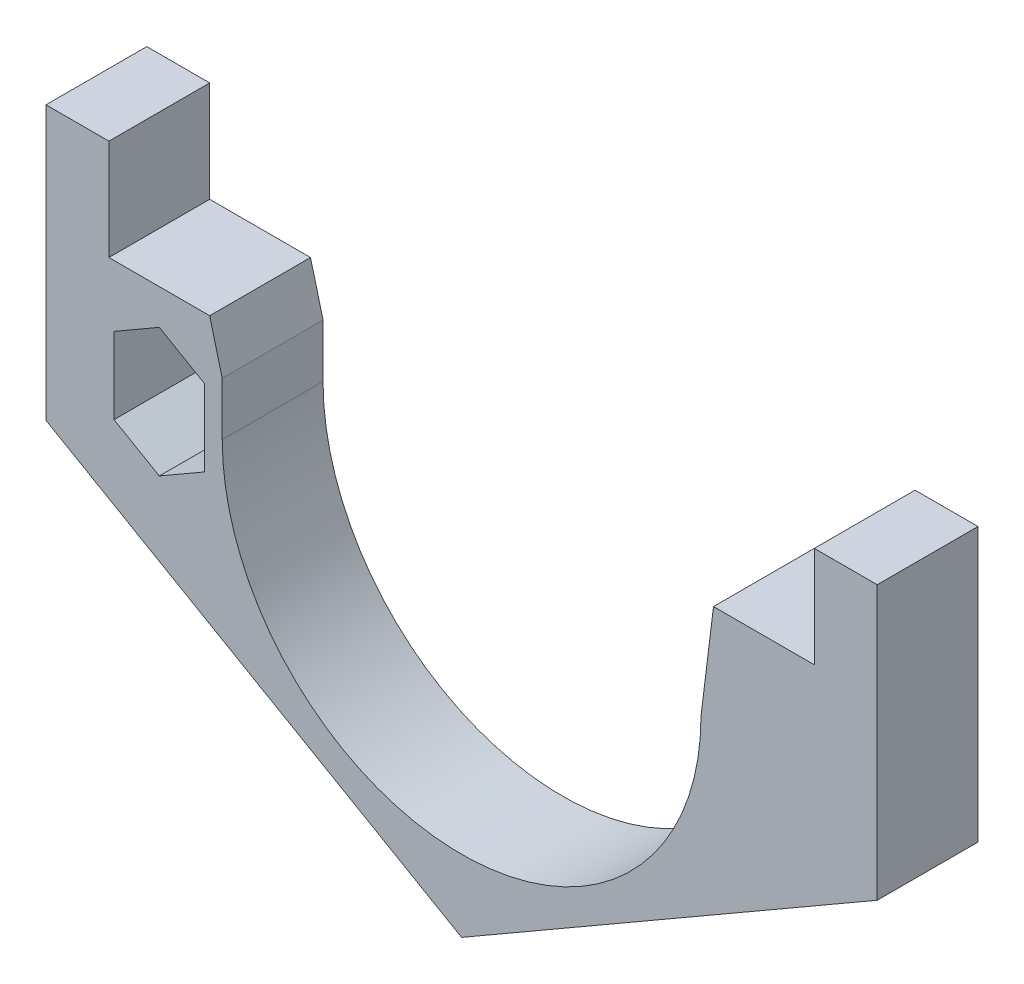
ISO-10303-21;
HEADER;
FILE_DESCRIPTION(('STEP AP214'),'2;1');
FILE_NAME('part.step','',(''),(''),'','','');
FILE_SCHEMA(('AUTOMOTIVE_DESIGN { 1 0 10303 214 1 1 1 1 }'));
ENDSEC;
DATA;
#1=APPLICATION_CONTEXT('core data for automotive mechanical design processes');
#2=APPLICATION_PROTOCOL_DEFINITION('international standard','automotive_design',2000,#1);
#3=PRODUCT_CONTEXT('',#1,'mechanical');
#4=PRODUCT('Part','Part','',(#3));
#5=PRODUCT_RELATED_PRODUCT_CATEGORY('part','',(#4));
#6=PRODUCT_DEFINITION_FORMATION('','',#4);
#7=PRODUCT_DEFINITION_CONTEXT('part definition',#1,'design');
#8=PRODUCT_DEFINITION('design','',#6,#7);
#9=PRODUCT_DEFINITION_SHAPE('','',#8);
#10=(LENGTH_UNIT() NAMED_UNIT(*) SI_UNIT(.MILLI.,.METRE.));
#11=(NAMED_UNIT(*) PLANE_ANGLE_UNIT() SI_UNIT($,.RADIAN.));
#12=(NAMED_UNIT(*) SI_UNIT($,.STERADIAN.) SOLID_ANGLE_UNIT());
#13=UNCERTAINTY_MEASURE_WITH_UNIT(LENGTH_MEASURE(1.E-05),#10,'distance_accuracy_value','');
#14=(GEOMETRIC_REPRESENTATION_CONTEXT(3) GLOBAL_UNCERTAINTY_ASSIGNED_CONTEXT((#13)) GLOBAL_UNIT_ASSIGNED_CONTEXT((#10,
#11,#12)) REPRESENTATION_CONTEXT('',''));
#15=CARTESIAN_POINT('',(0.,0.,0.));
#16=DIRECTION('',(0.,0.,1.));
#17=DIRECTION('',(1.,0.,0.));
#18=AXIS2_PLACEMENT_3D('',#15,#16,#17);
#19=CARTESIAN_POINT('',(0.,0.,20.));
#20=DIRECTION('',(0.,0.,1.));
#21=DIRECTION('',(1.,0.,0.));
#22=AXIS2_PLACEMENT_3D('',#19,#20,#21);
#23=PLANE('',#22);
#24=DIRECTION('',(0.,1.,0.));
#25=VECTOR('',#24,1.);
#26=CARTESIAN_POINT('',(-69.984452807585,20.0689803218662,20.));
#27=LINE('',#26,#25);
#28=CARTESIAN_POINT('',(-69.984452807585,20.0689803218662,20.));
#29=VERTEX_POINT('',#28);
#30=CARTESIAN_POINT('',(-69.9844528075851,40.0689803218662,20.));
#31=VERTEX_POINT('',#30);
#32=EDGE_CURVE('E225',#29,#31,#27,.T.);
#33=ORIENTED_EDGE('',*,*,#32,.T.);
#34=DIRECTION('',(-1.,0.,0.));
#35=VECTOR('',#34,1.);
#36=CARTESIAN_POINT('',(-69.9844528075851,40.0689803218662,20.));
#37=LINE('',#36,#35);
#38=CARTESIAN_POINT('',(-82.468350794959,40.0689803218662,20.));
#39=VERTEX_POINT('',#38);
#40=EDGE_CURVE('E228',#31,#39,#37,.T.);
#41=ORIENTED_EDGE('',*,*,#40,.T.);
#42=DIRECTION('',(0.,-1.,0.));
#43=VECTOR('',#42,1.);
#44=CARTESIAN_POINT('',(-82.468350794959,40.0689803218662,20.));
#45=LINE('',#44,#43);
#46=CARTESIAN_POINT('',(-82.4683507949589,-14.1633542721961,20.));
#47=VERTEX_POINT('',#46);
#48=EDGE_CURVE('E231',#39,#47,#45,.T.);
#49=ORIENTED_EDGE('',*,*,#48,.T.);
#50=DIRECTION('',(0.86602540378444,-0.499999999999998,0.));
#51=VECTOR('',#50,1.);
#52=CARTESIAN_POINT('',(0.,-61.7764788032899,20.));
#53=LINE('',#52,#51);
#54=CARTESIAN_POINT('',(0.,-61.7764788032899,20.));
#55=VERTEX_POINT('',#54);
#56=EDGE_CURVE('E233',#47,#55,#53,.T.);
#57=ORIENTED_EDGE('',*,*,#56,.T.);
#58=DIRECTION('',(0.86602540378444,0.499999999999998,0.));
#59=VECTOR('',#58,1.);
#60=CARTESIAN_POINT('',(0.,-61.7764788032899,20.));
#61=LINE('',#60,#59);
#62=CARTESIAN_POINT('',(82.4683507949589,-14.1633542721961,20.));
#63=VERTEX_POINT('',#62);
#64=EDGE_CURVE('E236',#55,#63,#61,.T.);
#65=ORIENTED_EDGE('',*,*,#64,.T.);
#66=DIRECTION('',(0.,1.,0.));
#67=VECTOR('',#66,1.);
#68=CARTESIAN_POINT('',(82.4683507949589,-14.1633542721961,20.));
#69=LINE('',#68,#67);
#70=CARTESIAN_POINT('',(82.468350794959,40.0689803218662,20.));
#71=VERTEX_POINT('',#70);
#72=EDGE_CURVE('E238',#63,#71,#69,.T.);
#73=ORIENTED_EDGE('',*,*,#72,.T.);
#74=DIRECTION('',(-1.,0.,0.));
#75=VECTOR('',#74,1.);
#76=CARTESIAN_POINT('',(69.9844528075851,40.0689803218662,20.));
#77=LINE('',#76,#75);
#78=CARTESIAN_POINT('',(69.9844528075851,40.0689803218662,20.));
#79=VERTEX_POINT('',#78);
#80=EDGE_CURVE('E241',#71,#79,#77,.T.);
#81=ORIENTED_EDGE('',*,*,#80,.T.);
#82=DIRECTION('',(0.,-1.,0.));
#83=VECTOR('',#82,1.);
#84=CARTESIAN_POINT('',(69.984452807585,20.0689803218662,20.));
#85=LINE('',#84,#83);
#86=CARTESIAN_POINT('',(69.984452807585,20.0689803218662,20.));
#87=VERTEX_POINT('',#86);
#88=EDGE_CURVE('E243',#79,#87,#85,.T.);
#89=ORIENTED_EDGE('',*,*,#88,.T.);
#90=DIRECTION('',(-1.,0.,0.));
#91=VECTOR('',#90,1.);
#92=CARTESIAN_POINT('',(49.984452807585,20.0689803218662,20.));
#93=LINE('',#92,#91);
#94=CARTESIAN_POINT('',(49.984452807585,20.0689803218662,20.));
#95=VERTEX_POINT('',#94);
#96=EDGE_CURVE('E245',#87,#95,#93,.T.);
#97=ORIENTED_EDGE('',*,*,#96,.T.);
#98=DIRECTION('',(-0.122857826012547,-0.992424281538632,0.));
#99=VECTOR('',#98,1.);
#100=CARTESIAN_POINT('',(49.984452807585,20.0689803218662,20.));
#101=LINE('',#100,#99);
#102=CARTESIAN_POINT('',(47.4999999999533,2.04558592287185E-11,20.));
#103=VERTEX_POINT('',#102);
#104=EDGE_CURVE('E247',#95,#103,#101,.T.);
#105=ORIENTED_EDGE('',*,*,#104,.T.);
#106=CARTESIAN_POINT('',(0.,0.,20.));
#107=DIRECTION('',(0.,0.,-1.));
#108=DIRECTION('',(1.,0.,0.));
#109=AXIS2_PLACEMENT_3D('',#106,#107,#108);
#110=CIRCLE('',#109,47.5);
#111=CARTESIAN_POINT('',(-47.5,2.05305101285412E-11,20.));
#112=VERTEX_POINT('',#111);
#113=EDGE_CURVE('E249',#103,#112,#110,.T.);
#114=ORIENTED_EDGE('',*,*,#113,.T.);
#115=DIRECTION('',(0.,1.,0.));
#116=VECTOR('',#115,1.);
#117=CARTESIAN_POINT('',(-47.5000000000467,2.05321870616615E-11,20.));
#118=LINE('',#117,#116);
#119=CARTESIAN_POINT('',(-47.5000000000467,10.5689803218662,20.));
#120=VERTEX_POINT('',#119);
#121=EDGE_CURVE('E251',#112,#120,#118,.T.);
#122=ORIENTED_EDGE('',*,*,#121,.T.);
#123=DIRECTION('',(-0.253012247802464,0.967463075503114,0.));
#124=VECTOR('',#123,1.);
#125=CARTESIAN_POINT('',(-47.5000000000467,10.5689803218662,20.));
#126=LINE('',#125,#124);
#127=CARTESIAN_POINT('',(-49.984452807585,20.0689803218662,20.));
#128=VERTEX_POINT('',#127);
#129=EDGE_CURVE('E253',#120,#128,#126,.T.);
#130=ORIENTED_EDGE('',*,*,#129,.T.);
#131=DIRECTION('',(-1.,0.,0.));
#132=VECTOR('',#131,1.);
#133=CARTESIAN_POINT('',(-49.984452807585,20.0689803218662,20.));
#134=LINE('',#133,#132);
#135=EDGE_CURVE('E255',#128,#29,#134,.T.);
#136=ORIENTED_EDGE('',*,*,#135,.T.);
#137=EDGE_LOOP('',(#33,#41,#49,#57,#65,#73,#81,#89,#97,#105,#114,#122,#130,#136));
#138=FACE_BOUND('',#137,.T.);
#139=DIRECTION('',(0.,-1.,0.));
#140=VECTOR('',#139,1.);
#141=CARTESIAN_POINT('',(-68.9689056151455,7.88180407490607,20.));
#142=LINE('',#141,#140);
#143=CARTESIAN_POINT('',(-68.9689056151455,7.88180407490607,20.));
#144=VERTEX_POINT('',#143);
#145=CARTESIAN_POINT('',(-68.9689056151455,-7.28624336352292,20.));
#146=VERTEX_POINT('',#145);
#147=EDGE_CURVE('E180',#144,#146,#142,.T.);
#148=ORIENTED_EDGE('',*,*,#147,.F.);
#149=DIRECTION('',(-0.86602540378444,-0.499999999999998,0.));
#150=VECTOR('',#149,1.);
#151=CARTESIAN_POINT('',(-59.9844528075961,13.0689803218662,20.));
#152=LINE('',#151,#150);
#153=CARTESIAN_POINT('',(-59.9844528075961,13.0689803218662,20.));
#154=VERTEX_POINT('',#153);
#155=EDGE_CURVE('E172',#154,#144,#152,.T.);
#156=ORIENTED_EDGE('',*,*,#155,.F.);
#157=DIRECTION('',(-0.86602540378444,0.499999999999998,0.));
#158=VECTOR('',#157,1.);
#159=CARTESIAN_POINT('',(-59.9844528075961,13.0689803218662,20.));
#160=LINE('',#159,#158);
#161=CARTESIAN_POINT('',(-51.0000000000467,7.88180407490607,20.));
#162=VERTEX_POINT('',#161);
#163=EDGE_CURVE('E201',#162,#154,#160,.T.);
#164=ORIENTED_EDGE('',*,*,#163,.F.);
#165=DIRECTION('',(0.,1.,0.));
#166=VECTOR('',#165,1.);
#167=CARTESIAN_POINT('',(-51.0000000000467,7.88180407490607,20.));
#168=LINE('',#167,#166);
#169=CARTESIAN_POINT('',(-51.0000000000467,-7.28624336352292,20.));
#170=VERTEX_POINT('',#169);
#171=EDGE_CURVE('E199',#170,#162,#168,.T.);
#172=ORIENTED_EDGE('',*,*,#171,.F.);
#173=DIRECTION('',(0.86602540378444,0.499999999999998,0.));
#174=VECTOR('',#173,1.);
#175=CARTESIAN_POINT('',(-59.9844528075961,-12.473419610483,20.));
#176=LINE('',#175,#174);
#177=CARTESIAN_POINT('',(-59.9844528075961,-12.473419610483,20.));
#178=VERTEX_POINT('',#177);
#179=EDGE_CURVE('E195',#178,#170,#176,.T.);
#180=ORIENTED_EDGE('',*,*,#179,.F.);
#181=DIRECTION('',(0.86602540378444,-0.499999999999998,0.));
#182=VECTOR('',#181,1.);
#183=CARTESIAN_POINT('',(-59.9844528075961,-12.473419610483,20.));
#184=LINE('',#183,#182);
#185=EDGE_CURVE('E193',#146,#178,#184,.T.);
#186=ORIENTED_EDGE('',*,*,#185,.F.);
#187=EDGE_LOOP('',(#148,#156,#164,#172,#180,#186));
#188=FACE_BOUND('',#187,.T.);
#189=ADVANCED_FACE('F35',(#138,#188),#23,.T.);
#190=CARTESIAN_POINT('',(0.,0.,0.));
#191=DIRECTION('',(0.,0.,1.));
#192=DIRECTION('',(1.,0.,0.));
#193=AXIS2_PLACEMENT_3D('',#190,#191,#192);
#194=PLANE('',#193);
#195=DIRECTION('',(0.,1.,0.));
#196=VECTOR('',#195,1.);
#197=CARTESIAN_POINT('',(-69.984452807585,20.0689803218662,0.));
#198=LINE('',#197,#196);
#199=CARTESIAN_POINT('',(-69.984452807585,20.0689803218662,0.));
#200=VERTEX_POINT('',#199);
#201=CARTESIAN_POINT('',(-69.9844528075851,40.0689803218662,0.));
#202=VERTEX_POINT('',#201);
#203=EDGE_CURVE('E188',#200,#202,#198,.T.);
#204=ORIENTED_EDGE('',*,*,#203,.F.);
#205=DIRECTION('',(-1.,0.,0.));
#206=VECTOR('',#205,1.);
#207=CARTESIAN_POINT('',(-49.984452807585,20.0689803218662,0.));
#208=LINE('',#207,#206);
#209=CARTESIAN_POINT('',(-49.984452807585,20.0689803218662,0.));
#210=VERTEX_POINT('',#209);
#211=EDGE_CURVE('E229',#210,#200,#208,.T.);
#212=ORIENTED_EDGE('',*,*,#211,.F.);
#213=DIRECTION('',(-0.253012247802464,0.967463075503114,0.));
#214=VECTOR('',#213,1.);
#215=CARTESIAN_POINT('',(-47.5000000000467,10.5689803218662,0.));
#216=LINE('',#215,#214);
#217=CARTESIAN_POINT('',(-47.5000000000467,10.5689803218662,0.));
#218=VERTEX_POINT('',#217);
#219=EDGE_CURVE('E286',#218,#210,#216,.T.);
#220=ORIENTED_EDGE('',*,*,#219,.F.);
#221=DIRECTION('',(0.,1.,0.));
#222=VECTOR('',#221,1.);
#223=CARTESIAN_POINT('',(-47.5000000000467,2.05321870616615E-11,0.));
#224=LINE('',#223,#222);
#225=CARTESIAN_POINT('',(-47.5,2.05305101285412E-11,0.));
#226=VERTEX_POINT('',#225);
#227=EDGE_CURVE('E284',#226,#218,#224,.T.);
#228=ORIENTED_EDGE('',*,*,#227,.F.);
#229=CARTESIAN_POINT('',(0.,0.,0.));
#230=DIRECTION('',(0.,0.,-1.));
#231=DIRECTION('',(1.,0.,0.));
#232=AXIS2_PLACEMENT_3D('',#229,#230,#231);
#233=CIRCLE('',#232,47.5);
#234=CARTESIAN_POINT('',(47.4999999999533,2.04558592287185E-11,0.));
#235=VERTEX_POINT('',#234);
#236=EDGE_CURVE('E282',#235,#226,#233,.T.);
#237=ORIENTED_EDGE('',*,*,#236,.F.);
#238=DIRECTION('',(-0.122857826012547,-0.992424281538632,0.));
#239=VECTOR('',#238,1.);
#240=CARTESIAN_POINT('',(49.984452807585,20.0689803218662,0.));
#241=LINE('',#240,#239);
#242=CARTESIAN_POINT('',(49.984452807585,20.0689803218662,0.));
#243=VERTEX_POINT('',#242);
#244=EDGE_CURVE('E280',#243,#235,#241,.T.);
#245=ORIENTED_EDGE('',*,*,#244,.F.);
#246=DIRECTION('',(-1.,0.,0.));
#247=VECTOR('',#246,1.);
#248=CARTESIAN_POINT('',(49.984452807585,20.0689803218662,0.));
#249=LINE('',#248,#247);
#250=CARTESIAN_POINT('',(69.984452807585,20.0689803218662,0.));
#251=VERTEX_POINT('',#250);
#252=EDGE_CURVE('E278',#251,#243,#249,.T.);
#253=ORIENTED_EDGE('',*,*,#252,.F.);
#254=DIRECTION('',(0.,-1.,0.));
#255=VECTOR('',#254,1.);
#256=CARTESIAN_POINT('',(69.984452807585,20.0689803218662,0.));
#257=LINE('',#256,#255);
#258=CARTESIAN_POINT('',(69.9844528075851,40.0689803218662,0.));
#259=VERTEX_POINT('',#258);
#260=EDGE_CURVE('E276',#259,#251,#257,.T.);
#261=ORIENTED_EDGE('',*,*,#260,.F.);
#262=DIRECTION('',(-1.,0.,0.));
#263=VECTOR('',#262,1.);
#264=CARTESIAN_POINT('',(69.9844528075851,40.0689803218662,0.));
#265=LINE('',#264,#263);
#266=CARTESIAN_POINT('',(82.468350794959,40.0689803218662,0.));
#267=VERTEX_POINT('',#266);
#268=EDGE_CURVE('E274',#267,#259,#265,.T.);
#269=ORIENTED_EDGE('',*,*,#268,.F.);
#270=DIRECTION('',(0.,1.,0.));
#271=VECTOR('',#270,1.);
#272=CARTESIAN_POINT('',(82.468350794959,40.0689803218662,0.));
#273=LINE('',#272,#271);
#274=CARTESIAN_POINT('',(82.4683507949589,-14.1633542721961,0.));
#275=VERTEX_POINT('',#274);
#276=EDGE_CURVE('E271',#275,#267,#273,.T.);
#277=ORIENTED_EDGE('',*,*,#276,.F.);
#278=DIRECTION('',(0.86602540378444,0.499999999999998,0.));
#279=VECTOR('',#278,1.);
#280=CARTESIAN_POINT('',(0.,-61.7764788032899,0.));
#281=LINE('',#280,#279);
#282=CARTESIAN_POINT('',(0.,-61.7764788032899,0.));
#283=VERTEX_POINT('',#282);
#284=EDGE_CURVE('E268',#283,#275,#281,.T.);
#285=ORIENTED_EDGE('',*,*,#284,.F.);
#286=DIRECTION('',(0.86602540378444,-0.499999999999998,0.));
#287=VECTOR('',#286,1.);
#288=CARTESIAN_POINT('',(0.,-61.7764788032899,0.));
#289=LINE('',#288,#287);
#290=CARTESIAN_POINT('',(-82.4683507949589,-14.1633542721961,0.));
#291=VERTEX_POINT('',#290);
#292=EDGE_CURVE('E265',#291,#283,#289,.T.);
#293=ORIENTED_EDGE('',*,*,#292,.F.);
#294=DIRECTION('',(0.,-1.,0.));
#295=VECTOR('',#294,1.);
#296=CARTESIAN_POINT('',(-82.4683507949589,-14.1633542721961,0.));
#297=LINE('',#296,#295);
#298=CARTESIAN_POINT('',(-82.468350794959,40.0689803218662,0.));
#299=VERTEX_POINT('',#298);
#300=EDGE_CURVE('E263',#299,#291,#297,.T.);
#301=ORIENTED_EDGE('',*,*,#300,.F.);
#302=DIRECTION('',(-1.,0.,0.));
#303=VECTOR('',#302,1.);
#304=CARTESIAN_POINT('',(-69.9844528075851,40.0689803218662,0.));
#305=LINE('',#304,#303);
#306=EDGE_CURVE('E260',#202,#299,#305,.T.);
#307=ORIENTED_EDGE('',*,*,#306,.F.);
#308=EDGE_LOOP('',(#204,#212,#220,#228,#237,#245,#253,#261,#269,#277,#285,#293,#301,#307));
#309=FACE_BOUND('',#308,.T.);
#310=DIRECTION('',(-0.86602540378444,-0.499999999999998,0.));
#311=VECTOR('',#310,1.);
#312=CARTESIAN_POINT('',(-59.9844528075961,13.0689803218662,0.));
#313=LINE('',#312,#311);
#314=CARTESIAN_POINT('',(-59.9844528075961,13.0689803218662,0.));
#315=VERTEX_POINT('',#314);
#316=CARTESIAN_POINT('',(-68.9689056151455,7.88180407490607,0.));
#317=VERTEX_POINT('',#316);
#318=EDGE_CURVE('E58',#315,#317,#313,.T.);
#319=ORIENTED_EDGE('',*,*,#318,.T.);
#320=DIRECTION('',(0.,-1.,0.));
#321=VECTOR('',#320,1.);
#322=CARTESIAN_POINT('',(-68.9689056151455,7.88180407490607,0.));
#323=LINE('',#322,#321);
#324=CARTESIAN_POINT('',(-68.9689056151455,-7.28624336352292,0.));
#325=VERTEX_POINT('',#324);
#326=EDGE_CURVE('E187',#317,#325,#323,.T.);
#327=ORIENTED_EDGE('',*,*,#326,.T.);
#328=DIRECTION('',(0.86602540378444,-0.499999999999998,0.));
#329=VECTOR('',#328,1.);
#330=CARTESIAN_POINT('',(-59.9844528075961,-12.473419610483,0.));
#331=LINE('',#330,#329);
#332=CARTESIAN_POINT('',(-59.9844528075961,-12.473419610483,0.));
#333=VERTEX_POINT('',#332);
#334=EDGE_CURVE('E205',#325,#333,#331,.T.);
#335=ORIENTED_EDGE('',*,*,#334,.T.);
#336=DIRECTION('',(0.86602540378444,0.499999999999998,0.));
#337=VECTOR('',#336,1.);
#338=CARTESIAN_POINT('',(-59.9844528075961,-12.473419610483,0.));
#339=LINE('',#338,#337);
#340=CARTESIAN_POINT('',(-51.0000000000467,-7.28624336352292,0.));
#341=VERTEX_POINT('',#340);
#342=EDGE_CURVE('E208',#333,#341,#339,.T.);
#343=ORIENTED_EDGE('',*,*,#342,.T.);
#344=DIRECTION('',(0.,1.,0.));
#345=VECTOR('',#344,1.);
#346=CARTESIAN_POINT('',(-51.0000000000467,7.88180407490607,0.));
#347=LINE('',#346,#345);
#348=CARTESIAN_POINT('',(-51.0000000000467,7.88180407490607,0.));
#349=VERTEX_POINT('',#348);
#350=EDGE_CURVE('E211',#341,#349,#347,.T.);
#351=ORIENTED_EDGE('',*,*,#350,.T.);
#352=DIRECTION('',(-0.86602540378444,0.499999999999998,0.));
#353=VECTOR('',#352,1.);
#354=CARTESIAN_POINT('',(-59.9844528075961,13.0689803218662,0.));
#355=LINE('',#354,#353);
#356=EDGE_CURVE('E181',#349,#315,#355,.T.);
#357=ORIENTED_EDGE('',*,*,#356,.T.);
#358=EDGE_LOOP('',(#319,#327,#335,#343,#351,#357));
#359=FACE_BOUND('',#358,.T.);
#360=ADVANCED_FACE('F334',(#309,#359),#194,.F.);
#361=CARTESIAN_POINT('',(-69.984452807585,20.0689803218662,20.));
#362=DIRECTION('',(-1.,0.,0.));
#363=DIRECTION('',(0.,-1.,0.));
#364=AXIS2_PLACEMENT_3D('',#361,#362,#363);
#365=PLANE('',#364);
#366=ORIENTED_EDGE('',*,*,#203,.T.);
#367=DIRECTION('',(0.,0.,-1.));
#368=VECTOR('',#367,1.);
#369=CARTESIAN_POINT('',(-69.9844528075851,40.0689803218662,20.));
#370=LINE('',#369,#368);
#371=EDGE_CURVE('E11',#31,#202,#370,.T.);
#372=ORIENTED_EDGE('',*,*,#371,.F.);
#373=ORIENTED_EDGE('',*,*,#32,.F.);
#374=DIRECTION('',(0.,0.,-1.));
#375=VECTOR('',#374,1.);
#376=CARTESIAN_POINT('',(-69.984452807585,20.0689803218662,20.));
#377=LINE('',#376,#375);
#378=EDGE_CURVE('E257',#29,#200,#377,.T.);
#379=ORIENTED_EDGE('',*,*,#378,.T.);
#380=EDGE_LOOP('',(#366,#372,#373,#379));
#381=FACE_BOUND('',#380,.T.);
#382=ADVANCED_FACE('F37',(#381),#365,.F.);
#383=CARTESIAN_POINT('',(-69.9844528075851,40.0689803218662,20.));
#384=DIRECTION('',(0.,-1.,0.));
#385=DIRECTION('',(0.,0.,-1.));
#386=AXIS2_PLACEMENT_3D('',#383,#384,#385);
#387=PLANE('',#386);
#388=ORIENTED_EDGE('',*,*,#306,.T.);
#389=DIRECTION('',(0.,0.,-1.));
#390=VECTOR('',#389,1.);
#391=CARTESIAN_POINT('',(-82.468350794959,40.0689803218662,20.));
#392=LINE('',#391,#390);
#393=EDGE_CURVE('E43',#39,#299,#392,.T.);
#394=ORIENTED_EDGE('',*,*,#393,.F.);
#395=ORIENTED_EDGE('',*,*,#40,.F.);
#396=ORIENTED_EDGE('',*,*,#371,.T.);
#397=EDGE_LOOP('',(#388,#394,#395,#396));
#398=FACE_BOUND('',#397,.T.);
#399=ADVANCED_FACE('F330',(#398),#387,.F.);
#400=CARTESIAN_POINT('',(-82.4683507949589,-14.1633542721961,20.));
#401=DIRECTION('',(1.,0.,0.));
#402=DIRECTION('',(0.,1.,0.));
#403=AXIS2_PLACEMENT_3D('',#400,#401,#402);
#404=PLANE('',#403);
#405=ORIENTED_EDGE('',*,*,#300,.T.);
#406=DIRECTION('',(0.,0.,-1.));
#407=VECTOR('',#406,1.);
#408=CARTESIAN_POINT('',(-82.4683507949589,-14.1633542721961,20.));
#409=LINE('',#408,#407);
#410=EDGE_CURVE('E321',#47,#291,#409,.T.);
#411=ORIENTED_EDGE('',*,*,#410,.F.);
#412=ORIENTED_EDGE('',*,*,#48,.F.);
#413=ORIENTED_EDGE('',*,*,#393,.T.);
#414=EDGE_LOOP('',(#405,#411,#412,#413));
#415=FACE_BOUND('',#414,.T.);
#416=ADVANCED_FACE('F327',(#415),#404,.F.);
#417=CARTESIAN_POINT('',(0.,-61.7764788032899,20.));
#418=DIRECTION('',(0.499999999999998,0.86602540378444,0.));
#419=DIRECTION('',(-0.86602540378444,0.499999999999998,0.));
#420=AXIS2_PLACEMENT_3D('',#417,#418,#419);
#421=PLANE('',#420);
#422=ORIENTED_EDGE('',*,*,#292,.T.);
#423=DIRECTION('',(0.,0.,-1.));
#424=VECTOR('',#423,1.);
#425=CARTESIAN_POINT('',(0.,-61.7764788032899,20.));
#426=LINE('',#425,#424);
#427=EDGE_CURVE('E318',#55,#283,#426,.T.);
#428=ORIENTED_EDGE('',*,*,#427,.F.);
#429=ORIENTED_EDGE('',*,*,#56,.F.);
#430=ORIENTED_EDGE('',*,*,#410,.T.);
#431=EDGE_LOOP('',(#422,#428,#429,#430));
#432=FACE_BOUND('',#431,.T.);
#433=ADVANCED_FACE('F341',(#432),#421,.F.);
#434=CARTESIAN_POINT('',(0.,-61.7764788032899,20.));
#435=DIRECTION('',(-0.499999999999998,0.86602540378444,0.));
#436=DIRECTION('',(-0.86602540378444,-0.499999999999998,0.));
#437=AXIS2_PLACEMENT_3D('',#434,#435,#436);
#438=PLANE('',#437);
#439=ORIENTED_EDGE('',*,*,#284,.T.);
#440=DIRECTION('',(0.,0.,-1.));
#441=VECTOR('',#440,1.);
#442=CARTESIAN_POINT('',(82.4683507949589,-14.1633542721961,20.));
#443=LINE('',#442,#441);
#444=EDGE_CURVE('E315',#63,#275,#443,.T.);
#445=ORIENTED_EDGE('',*,*,#444,.F.);
#446=ORIENTED_EDGE('',*,*,#64,.F.);
#447=ORIENTED_EDGE('',*,*,#427,.T.);
#448=EDGE_LOOP('',(#439,#445,#446,#447));
#449=FACE_BOUND('',#448,.T.);
#450=ADVANCED_FACE('F345',(#449),#438,.F.);
#451=CARTESIAN_POINT('',(82.468350794959,40.0689803218662,20.));
#452=DIRECTION('',(-1.,0.,0.));
#453=DIRECTION('',(0.,-1.,0.));
#454=AXIS2_PLACEMENT_3D('',#451,#452,#453);
#455=PLANE('',#454);
#456=ORIENTED_EDGE('',*,*,#276,.T.);
#457=DIRECTION('',(0.,0.,-1.));
#458=VECTOR('',#457,1.);
#459=CARTESIAN_POINT('',(82.468350794959,40.0689803218662,20.));
#460=LINE('',#459,#458);
#461=EDGE_CURVE('E312',#71,#267,#460,.T.);
#462=ORIENTED_EDGE('',*,*,#461,.F.);
#463=ORIENTED_EDGE('',*,*,#72,.F.);
#464=ORIENTED_EDGE('',*,*,#444,.T.);
#465=EDGE_LOOP('',(#456,#462,#463,#464));
#466=FACE_BOUND('',#465,.T.);
#467=ADVANCED_FACE('F392',(#466),#455,.F.);
#468=CARTESIAN_POINT('',(69.9844528075851,40.0689803218662,20.));
#469=DIRECTION('',(0.,-1.,0.));
#470=DIRECTION('',(1.,0.,0.));
#471=AXIS2_PLACEMENT_3D('',#468,#469,#470);
#472=PLANE('',#471);
#473=ORIENTED_EDGE('',*,*,#268,.T.);
#474=DIRECTION('',(0.,0.,-1.));
#475=VECTOR('',#474,1.);
#476=CARTESIAN_POINT('',(69.9844528075851,40.0689803218662,20.));
#477=LINE('',#476,#475);
#478=EDGE_CURVE('E309',#79,#259,#477,.T.);
#479=ORIENTED_EDGE('',*,*,#478,.F.);
#480=ORIENTED_EDGE('',*,*,#80,.F.);
#481=ORIENTED_EDGE('',*,*,#461,.T.);
#482=EDGE_LOOP('',(#473,#479,#480,#481));
#483=FACE_BOUND('',#482,.T.);
#484=ADVANCED_FACE('F389',(#483),#472,.F.);
#485=CARTESIAN_POINT('',(69.984452807585,20.0689803218662,20.));
#486=DIRECTION('',(1.,0.,0.));
#487=DIRECTION('',(0.,1.,0.));
#488=AXIS2_PLACEMENT_3D('',#485,#486,#487);
#489=PLANE('',#488);
#490=ORIENTED_EDGE('',*,*,#260,.T.);
#491=DIRECTION('',(0.,0.,-1.));
#492=VECTOR('',#491,1.);
#493=CARTESIAN_POINT('',(69.984452807585,20.0689803218662,20.));
#494=LINE('',#493,#492);
#495=EDGE_CURVE('E306',#87,#251,#494,.T.);
#496=ORIENTED_EDGE('',*,*,#495,.F.);
#497=ORIENTED_EDGE('',*,*,#88,.F.);
#498=ORIENTED_EDGE('',*,*,#478,.T.);
#499=EDGE_LOOP('',(#490,#496,#497,#498));
#500=FACE_BOUND('',#499,.T.);
#501=ADVANCED_FACE('F385',(#500),#489,.F.);
#502=CARTESIAN_POINT('',(49.984452807585,20.0689803218662,20.));
#503=DIRECTION('',(0.,-1.,0.));
#504=DIRECTION('',(1.,0.,0.));
#505=AXIS2_PLACEMENT_3D('',#502,#503,#504);
#506=PLANE('',#505);
#507=ORIENTED_EDGE('',*,*,#252,.T.);
#508=DIRECTION('',(0.,0.,-1.));
#509=VECTOR('',#508,1.);
#510=CARTESIAN_POINT('',(49.984452807585,20.0689803218662,20.));
#511=LINE('',#510,#509);
#512=EDGE_CURVE('E303',#95,#243,#511,.T.);
#513=ORIENTED_EDGE('',*,*,#512,.F.);
#514=ORIENTED_EDGE('',*,*,#96,.F.);
#515=ORIENTED_EDGE('',*,*,#495,.T.);
#516=EDGE_LOOP('',(#507,#513,#514,#515));
#517=FACE_BOUND('',#516,.T.);
#518=ADVANCED_FACE('F381',(#517),#506,.F.);
#519=CARTESIAN_POINT('',(49.984452807585,20.0689803218662,20.));
#520=DIRECTION('',(0.992424281538632,-0.122857826012547,0.));
#521=DIRECTION('',(0.122857826012547,0.992424281538633,0.));
#522=AXIS2_PLACEMENT_3D('',#519,#520,#521);
#523=PLANE('',#522);
#524=ORIENTED_EDGE('',*,*,#244,.T.);
#525=DIRECTION('',(0.,0.,-1.));
#526=VECTOR('',#525,1.);
#527=CARTESIAN_POINT('',(47.4999999999533,2.04558592287185E-11,20.));
#528=LINE('',#527,#526);
#529=EDGE_CURVE('E300',#103,#235,#528,.T.);
#530=ORIENTED_EDGE('',*,*,#529,.F.);
#531=ORIENTED_EDGE('',*,*,#104,.F.);
#532=ORIENTED_EDGE('',*,*,#512,.T.);
#533=EDGE_LOOP('',(#524,#530,#531,#532));
#534=FACE_BOUND('',#533,.T.);
#535=ADVANCED_FACE('F376',(#534),#523,.F.);
#536=CARTESIAN_POINT('',(0.,0.,20.));
#537=DIRECTION('',(0.,0.,-1.));
#538=DIRECTION('',(-1.,0.,0.));
#539=AXIS2_PLACEMENT_3D('',#536,#537,#538);
#540=CYLINDRICAL_SURFACE('',#539,47.5);
#541=ORIENTED_EDGE('',*,*,#236,.T.);
#542=DIRECTION('',(0.,0.,-1.));
#543=VECTOR('',#542,1.);
#544=CARTESIAN_POINT('',(-47.5,2.05305101285412E-11,20.));
#545=LINE('',#544,#543);
#546=EDGE_CURVE('E297',#112,#226,#545,.T.);
#547=ORIENTED_EDGE('',*,*,#546,.F.);
#548=ORIENTED_EDGE('',*,*,#113,.F.);
#549=ORIENTED_EDGE('',*,*,#529,.T.);
#550=EDGE_LOOP('',(#541,#547,#548,#549));
#551=FACE_BOUND('',#550,.T.);
#552=ADVANCED_FACE('F370',(#551),#540,.F.);
#553=CARTESIAN_POINT('',(-47.5000000000467,2.05321870616615E-11,20.));
#554=DIRECTION('',(-1.,0.,0.));
#555=DIRECTION('',(0.,0.,1.));
#556=AXIS2_PLACEMENT_3D('',#553,#554,#555);
#557=PLANE('',#556);
#558=ORIENTED_EDGE('',*,*,#227,.T.);
#559=DIRECTION('',(0.,0.,-1.));
#560=VECTOR('',#559,1.);
#561=CARTESIAN_POINT('',(-47.5000000000467,10.5689803218662,20.));
#562=LINE('',#561,#560);
#563=EDGE_CURVE('E294',#120,#218,#562,.T.);
#564=ORIENTED_EDGE('',*,*,#563,.F.);
#565=ORIENTED_EDGE('',*,*,#121,.F.);
#566=ORIENTED_EDGE('',*,*,#546,.T.);
#567=EDGE_LOOP('',(#558,#564,#565,#566));
#568=FACE_BOUND('',#567,.T.);
#569=ADVANCED_FACE('F366',(#568),#557,.F.);
#570=CARTESIAN_POINT('',(-47.5000000000467,10.5689803218662,20.));
#571=DIRECTION('',(-0.967463075503114,-0.253012247802464,0.));
#572=DIRECTION('',(0.253012247802464,-0.967463075503114,0.));
#573=AXIS2_PLACEMENT_3D('',#570,#571,#572);
#574=PLANE('',#573);
#575=ORIENTED_EDGE('',*,*,#219,.T.);
#576=DIRECTION('',(0.,0.,-1.));
#577=VECTOR('',#576,1.);
#578=CARTESIAN_POINT('',(-49.984452807585,20.0689803218662,20.));
#579=LINE('',#578,#577);
#580=EDGE_CURVE('E291',#128,#210,#579,.T.);
#581=ORIENTED_EDGE('',*,*,#580,.F.);
#582=ORIENTED_EDGE('',*,*,#129,.F.);
#583=ORIENTED_EDGE('',*,*,#563,.T.);
#584=EDGE_LOOP('',(#575,#581,#582,#583));
#585=FACE_BOUND('',#584,.T.);
#586=ADVANCED_FACE('F361',(#585),#574,.F.);
#587=CARTESIAN_POINT('',(-49.984452807585,20.0689803218662,20.));
#588=DIRECTION('',(0.,-1.,0.));
#589=DIRECTION('',(1.,0.,0.));
#590=AXIS2_PLACEMENT_3D('',#587,#588,#589);
#591=PLANE('',#590);
#592=ORIENTED_EDGE('',*,*,#211,.T.);
#593=ORIENTED_EDGE('',*,*,#378,.F.);
#594=ORIENTED_EDGE('',*,*,#135,.F.);
#595=ORIENTED_EDGE('',*,*,#580,.T.);
#596=EDGE_LOOP('',(#592,#593,#594,#595));
#597=FACE_BOUND('',#596,.T.);
#598=ADVANCED_FACE('F355',(#597),#591,.F.);
#599=CARTESIAN_POINT('',(-59.9844528075961,13.0689803218662,20.));
#600=DIRECTION('',(0.499999999999998,-0.86602540378444,0.));
#601=DIRECTION('',(0.86602540378444,0.499999999999998,0.));
#602=AXIS2_PLACEMENT_3D('',#599,#600,#601);
#603=PLANE('',#602);
#604=ORIENTED_EDGE('',*,*,#318,.F.);
#605=DIRECTION('',(0.,0.,-1.));
#606=VECTOR('',#605,1.);
#607=CARTESIAN_POINT('',(-59.9844528075961,13.0689803218662,20.));
#608=LINE('',#607,#606);
#609=EDGE_CURVE('E176',#154,#315,#608,.T.);
#610=ORIENTED_EDGE('',*,*,#609,.F.);
#611=ORIENTED_EDGE('',*,*,#155,.T.);
#612=DIRECTION('',(0.,0.,-1.));
#613=VECTOR('',#612,1.);
#614=CARTESIAN_POINT('',(-68.9689056151455,7.88180407490607,20.));
#615=LINE('',#614,#613);
#616=EDGE_CURVE('E175',#144,#317,#615,.T.);
#617=ORIENTED_EDGE('',*,*,#616,.T.);
#618=EDGE_LOOP('',(#604,#610,#611,#617));
#619=FACE_BOUND('',#618,.T.);
#620=ADVANCED_FACE('F174',(#619),#603,.T.);
#621=CARTESIAN_POINT('',(-68.9689056151455,7.88180407490607,20.));
#622=DIRECTION('',(1.,0.,0.));
#623=DIRECTION('',(0.,0.,-1.));
#624=AXIS2_PLACEMENT_3D('',#621,#622,#623);
#625=PLANE('',#624);
#626=ORIENTED_EDGE('',*,*,#326,.F.);
#627=ORIENTED_EDGE('',*,*,#616,.F.);
#628=ORIENTED_EDGE('',*,*,#147,.T.);
#629=DIRECTION('',(0.,0.,-1.));
#630=VECTOR('',#629,1.);
#631=CARTESIAN_POINT('',(-68.9689056151455,-7.28624336352292,20.));
#632=LINE('',#631,#630);
#633=EDGE_CURVE('E189',#146,#325,#632,.T.);
#634=ORIENTED_EDGE('',*,*,#633,.T.);
#635=EDGE_LOOP('',(#626,#627,#628,#634));
#636=FACE_BOUND('',#635,.T.);
#637=ADVANCED_FACE('F184',(#636),#625,.T.);
#638=CARTESIAN_POINT('',(-59.9844528075961,-12.473419610483,20.));
#639=DIRECTION('',(0.499999999999998,0.86602540378444,0.));
#640=DIRECTION('',(-0.86602540378444,0.499999999999998,0.));
#641=AXIS2_PLACEMENT_3D('',#638,#639,#640);
#642=PLANE('',#641);
#643=ORIENTED_EDGE('',*,*,#334,.F.);
#644=ORIENTED_EDGE('',*,*,#633,.F.);
#645=ORIENTED_EDGE('',*,*,#185,.T.);
#646=DIRECTION('',(0.,0.,-1.));
#647=VECTOR('',#646,1.);
#648=CARTESIAN_POINT('',(-59.9844528075961,-12.473419610483,20.));
#649=LINE('',#648,#647);
#650=EDGE_CURVE('E222',#178,#333,#649,.T.);
#651=ORIENTED_EDGE('',*,*,#650,.T.);
#652=EDGE_LOOP('',(#643,#644,#645,#651));
#653=FACE_BOUND('',#652,.T.);
#654=ADVANCED_FACE('F462',(#653),#642,.T.);
#655=CARTESIAN_POINT('',(-59.9844528075961,-12.473419610483,20.));
#656=DIRECTION('',(-0.499999999999998,0.86602540378444,0.));
#657=DIRECTION('',(-0.86602540378444,-0.499999999999998,0.));
#658=AXIS2_PLACEMENT_3D('',#655,#656,#657);
#659=PLANE('',#658);
#660=ORIENTED_EDGE('',*,*,#342,.F.);
#661=ORIENTED_EDGE('',*,*,#650,.F.);
#662=ORIENTED_EDGE('',*,*,#179,.T.);
#663=DIRECTION('',(0.,0.,-1.));
#664=VECTOR('',#663,1.);
#665=CARTESIAN_POINT('',(-51.0000000000467,-7.28624336352292,20.));
#666=LINE('',#665,#664);
#667=EDGE_CURVE('E220',#170,#341,#666,.T.);
#668=ORIENTED_EDGE('',*,*,#667,.T.);
#669=EDGE_LOOP('',(#660,#661,#662,#668));
#670=FACE_BOUND('',#669,.T.);
#671=ADVANCED_FACE('F468',(#670),#659,.T.);
#672=CARTESIAN_POINT('',(-51.0000000000467,7.88180407490607,20.));
#673=DIRECTION('',(-1.,0.,0.));
#674=DIRECTION('',(0.,0.,1.));
#675=AXIS2_PLACEMENT_3D('',#672,#673,#674);
#676=PLANE('',#675);
#677=ORIENTED_EDGE('',*,*,#350,.F.);
#678=ORIENTED_EDGE('',*,*,#667,.F.);
#679=ORIENTED_EDGE('',*,*,#171,.T.);
#680=DIRECTION('',(0.,0.,-1.));
#681=VECTOR('',#680,1.);
#682=CARTESIAN_POINT('',(-51.0000000000467,7.88180407490607,20.));
#683=LINE('',#682,#681);
#684=EDGE_CURVE('E50',#162,#349,#683,.T.);
#685=ORIENTED_EDGE('',*,*,#684,.T.);
#686=EDGE_LOOP('',(#677,#678,#679,#685));
#687=FACE_BOUND('',#686,.T.);
#688=ADVANCED_FACE('F476',(#687),#676,.T.);
#689=CARTESIAN_POINT('',(-59.9844528075961,13.0689803218662,20.));
#690=DIRECTION('',(-0.499999999999998,-0.86602540378444,0.));
#691=DIRECTION('',(0.86602540378444,-0.499999999999998,0.));
#692=AXIS2_PLACEMENT_3D('',#689,#690,#691);
#693=PLANE('',#692);
#694=ORIENTED_EDGE('',*,*,#356,.F.);
#695=ORIENTED_EDGE('',*,*,#684,.F.);
#696=ORIENTED_EDGE('',*,*,#163,.T.);
#697=ORIENTED_EDGE('',*,*,#609,.T.);
#698=EDGE_LOOP('',(#694,#695,#696,#697));
#699=FACE_BOUND('',#698,.T.);
#700=ADVANCED_FACE('F484',(#699),#693,.T.);
#701=CLOSED_SHELL('',(#189,#360,#382,#399,#416,#433,#450,#467,#484,#501,#518,#535,#552,#569,
#586,#598,#620,#637,#654,#671,#688,#700));
#702=MANIFOLD_SOLID_BREP('B2',#701);
#703=ADVANCED_BREP_SHAPE_REPRESENTATION('',(#18,#702),#14);
#704=SHAPE_DEFINITION_REPRESENTATION(#9,#703);
ENDSEC;
END-ISO-10303-21;
